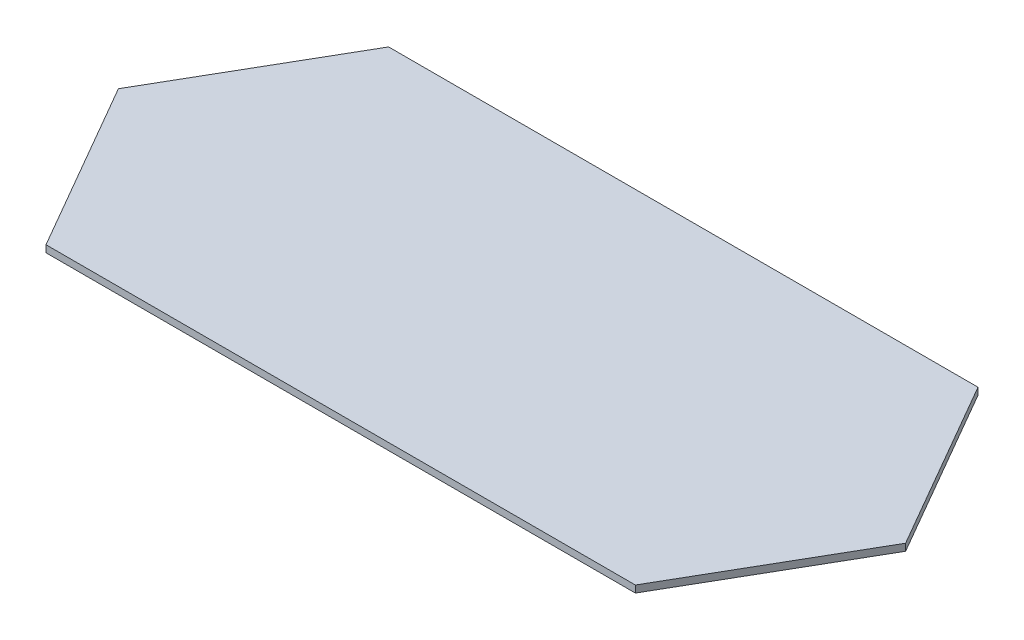
ISO-10303-21;
HEADER;
FILE_DESCRIPTION(('STEP AP214'),'2;1');
FILE_NAME('part.step','',(''),(''),'','','');
FILE_SCHEMA(('AUTOMOTIVE_DESIGN { 1 0 10303 214 1 1 1 1 }'));
ENDSEC;
DATA;
#1=APPLICATION_CONTEXT('core data for automotive mechanical design processes');
#2=APPLICATION_PROTOCOL_DEFINITION('international standard','automotive_design',2000,#1);
#3=PRODUCT_CONTEXT('',#1,'mechanical');
#4=PRODUCT('Part','Part','',(#3));
#5=PRODUCT_RELATED_PRODUCT_CATEGORY('part','',(#4));
#6=PRODUCT_DEFINITION_FORMATION('','',#4);
#7=PRODUCT_DEFINITION_CONTEXT('part definition',#1,'design');
#8=PRODUCT_DEFINITION('design','',#6,#7);
#9=PRODUCT_DEFINITION_SHAPE('','',#8);
#10=(LENGTH_UNIT() NAMED_UNIT(*) SI_UNIT(.MILLI.,.METRE.));
#11=(NAMED_UNIT(*) PLANE_ANGLE_UNIT() SI_UNIT($,.RADIAN.));
#12=(NAMED_UNIT(*) SI_UNIT($,.STERADIAN.) SOLID_ANGLE_UNIT());
#13=UNCERTAINTY_MEASURE_WITH_UNIT(LENGTH_MEASURE(1.E-05),#10,'distance_accuracy_value','');
#14=(GEOMETRIC_REPRESENTATION_CONTEXT(3) GLOBAL_UNCERTAINTY_ASSIGNED_CONTEXT((#13)) GLOBAL_UNIT_ASSIGNED_CONTEXT((#10,
#11,#12)) REPRESENTATION_CONTEXT('',''));
#15=CARTESIAN_POINT('',(0.,0.,0.));
#16=DIRECTION('',(0.,0.,1.));
#17=DIRECTION('',(1.,0.,0.));
#18=AXIS2_PLACEMENT_3D('',#15,#16,#17);
#19=CARTESIAN_POINT('',(445.421268129176,6.35,155.575));
#20=DIRECTION('',(-0.866025403784439,0.,-0.5));
#21=DIRECTION('',(-0.5,0.,0.866025403784439));
#22=AXIS2_PLACEMENT_3D('',#19,#20,#21);
#23=PLANE('',#22);
#24=DIRECTION('',(0.5,0.,-0.866025403784439));
#25=VECTOR('',#24,1.);
#26=CARTESIAN_POINT('',(445.421268129176,0.,155.575));
#27=LINE('',#26,#25);
#28=CARTESIAN_POINT('',(445.421268129176,0.,155.575));
#29=VERTEX_POINT('',#28);
#30=CARTESIAN_POINT('',(535.242536258352,0.,0.));
#31=VERTEX_POINT('',#30);
#32=EDGE_CURVE('E116',#29,#31,#27,.T.);
#33=ORIENTED_EDGE('',*,*,#32,.T.);
#34=DIRECTION('',(0.,-1.,0.));
#35=VECTOR('',#34,1.);
#36=CARTESIAN_POINT('',(535.242536258352,6.35,0.));
#37=LINE('',#36,#35);
#38=CARTESIAN_POINT('',(535.242536258352,6.35,0.));
#39=VERTEX_POINT('',#38);
#40=EDGE_CURVE('E41',#39,#31,#37,.T.);
#41=ORIENTED_EDGE('',*,*,#40,.F.);
#42=DIRECTION('',(0.5,0.,-0.866025403784439));
#43=VECTOR('',#42,1.);
#44=CARTESIAN_POINT('',(445.421268129176,6.35,155.575));
#45=LINE('',#44,#43);
#46=CARTESIAN_POINT('',(445.421268129176,6.35,155.575));
#47=VERTEX_POINT('',#46);
#48=EDGE_CURVE('E140',#47,#39,#45,.T.);
#49=ORIENTED_EDGE('',*,*,#48,.F.);
#50=DIRECTION('',(0.,-1.,0.));
#51=VECTOR('',#50,1.);
#52=CARTESIAN_POINT('',(445.421268129176,6.35,155.575));
#53=LINE('',#52,#51);
#54=EDGE_CURVE('E11',#47,#29,#53,.T.);
#55=ORIENTED_EDGE('',*,*,#54,.T.);
#56=EDGE_LOOP('',(#33,#41,#49,#55));
#57=FACE_BOUND('',#56,.T.);
#58=ADVANCED_FACE('F33',(#57),#23,.F.);
#59=CARTESIAN_POINT('',(535.242536258352,6.35,0.));
#60=DIRECTION('',(-0.866025403784439,0.,0.5));
#61=DIRECTION('',(0.5,0.,0.866025403784439));
#62=AXIS2_PLACEMENT_3D('',#59,#60,#61);
#63=PLANE('',#62);
#64=DIRECTION('',(-0.5,0.,-0.866025403784439));
#65=VECTOR('',#64,1.);
#66=CARTESIAN_POINT('',(535.242536258352,0.,0.));
#67=LINE('',#66,#65);
#68=CARTESIAN_POINT('',(445.421268129176,0.,-155.575));
#69=VERTEX_POINT('',#68);
#70=EDGE_CURVE('E118',#31,#69,#67,.T.);
#71=ORIENTED_EDGE('',*,*,#70,.T.);
#72=DIRECTION('',(0.,-1.,0.));
#73=VECTOR('',#72,1.);
#74=CARTESIAN_POINT('',(445.421268129176,6.35,-155.575));
#75=LINE('',#74,#73);
#76=CARTESIAN_POINT('',(445.421268129176,6.35,-155.575));
#77=VERTEX_POINT('',#76);
#78=EDGE_CURVE('E105',#77,#69,#75,.T.);
#79=ORIENTED_EDGE('',*,*,#78,.F.);
#80=DIRECTION('',(-0.5,0.,-0.866025403784439));
#81=VECTOR('',#80,1.);
#82=CARTESIAN_POINT('',(535.242536258352,6.35,0.));
#83=LINE('',#82,#81);
#84=EDGE_CURVE('E97',#39,#77,#83,.T.);
#85=ORIENTED_EDGE('',*,*,#84,.F.);
#86=ORIENTED_EDGE('',*,*,#40,.T.);
#87=EDGE_LOOP('',(#71,#79,#85,#86));
#88=FACE_BOUND('',#87,.T.);
#89=ADVANCED_FACE('F132',(#88),#63,.F.);
#90=CARTESIAN_POINT('',(89.821268129176,6.35,-155.575));
#91=DIRECTION('',(0.,0.,1.));
#92=DIRECTION('',(1.,0.,0.));
#93=AXIS2_PLACEMENT_3D('',#90,#91,#92);
#94=PLANE('',#93);
#95=DIRECTION('',(-1.,0.,0.));
#96=VECTOR('',#95,1.);
#97=CARTESIAN_POINT('',(89.821268129176,0.,-155.575));
#98=LINE('',#97,#96);
#99=CARTESIAN_POINT('',(-89.821268129176,0.,-155.575));
#100=VERTEX_POINT('',#99);
#101=EDGE_CURVE('E104',#69,#100,#98,.T.);
#102=ORIENTED_EDGE('',*,*,#101,.T.);
#103=DIRECTION('',(0.,-1.,0.));
#104=VECTOR('',#103,1.);
#105=CARTESIAN_POINT('',(-89.821268129176,6.35,-155.575));
#106=LINE('',#105,#104);
#107=CARTESIAN_POINT('',(-89.821268129176,6.35,-155.575));
#108=VERTEX_POINT('',#107);
#109=EDGE_CURVE('E102',#108,#100,#106,.T.);
#110=ORIENTED_EDGE('',*,*,#109,.F.);
#111=DIRECTION('',(-1.,0.,0.));
#112=VECTOR('',#111,1.);
#113=CARTESIAN_POINT('',(445.421268129176,6.35,-155.575));
#114=LINE('',#113,#112);
#115=EDGE_CURVE('E91',#77,#108,#114,.T.);
#116=ORIENTED_EDGE('',*,*,#115,.F.);
#117=ORIENTED_EDGE('',*,*,#78,.T.);
#118=EDGE_LOOP('',(#102,#110,#116,#117));
#119=FACE_BOUND('',#118,.T.);
#120=ADVANCED_FACE('F103',(#119),#94,.F.);
#121=CARTESIAN_POINT('',(-89.821268129176,6.35,-155.575));
#122=DIRECTION('',(0.866025403784439,0.,0.5));
#123=DIRECTION('',(0.5,0.,-0.866025403784439));
#124=AXIS2_PLACEMENT_3D('',#121,#122,#123);
#125=PLANE('',#124);
#126=DIRECTION('',(-0.5,0.,0.866025403784439));
#127=VECTOR('',#126,1.);
#128=CARTESIAN_POINT('',(-89.821268129176,0.,-155.575));
#129=LINE('',#128,#127);
#130=CARTESIAN_POINT('',(-179.642536258352,0.,0.));
#131=VERTEX_POINT('',#130);
#132=EDGE_CURVE('E73',#100,#131,#129,.T.);
#133=ORIENTED_EDGE('',*,*,#132,.T.);
#134=DIRECTION('',(0.,-1.,0.));
#135=VECTOR('',#134,1.);
#136=CARTESIAN_POINT('',(-179.642536258352,6.35,0.));
#137=LINE('',#136,#135);
#138=CARTESIAN_POINT('',(-179.642536258352,6.35,0.));
#139=VERTEX_POINT('',#138);
#140=EDGE_CURVE('E106',#139,#131,#137,.T.);
#141=ORIENTED_EDGE('',*,*,#140,.F.);
#142=DIRECTION('',(-0.5,0.,0.866025403784439));
#143=VECTOR('',#142,1.);
#144=CARTESIAN_POINT('',(-89.821268129176,6.35,-155.575));
#145=LINE('',#144,#143);
#146=EDGE_CURVE('E95',#108,#139,#145,.T.);
#147=ORIENTED_EDGE('',*,*,#146,.F.);
#148=ORIENTED_EDGE('',*,*,#109,.T.);
#149=EDGE_LOOP('',(#133,#141,#147,#148));
#150=FACE_BOUND('',#149,.T.);
#151=ADVANCED_FACE('F108',(#150),#125,.F.);
#152=CARTESIAN_POINT('',(-179.642536258352,6.35,0.));
#153=DIRECTION('',(0.866025403784439,0.,-0.5));
#154=DIRECTION('',(-0.5,0.,-0.866025403784439));
#155=AXIS2_PLACEMENT_3D('',#152,#153,#154);
#156=PLANE('',#155);
#157=DIRECTION('',(0.5,0.,0.866025403784439));
#158=VECTOR('',#157,1.);
#159=CARTESIAN_POINT('',(-179.642536258352,0.,0.));
#160=LINE('',#159,#158);
#161=CARTESIAN_POINT('',(-89.821268129176,0.,155.575));
#162=VERTEX_POINT('',#161);
#163=EDGE_CURVE('E80',#131,#162,#160,.T.);
#164=ORIENTED_EDGE('',*,*,#163,.T.);
#165=DIRECTION('',(0.,-1.,0.));
#166=VECTOR('',#165,1.);
#167=CARTESIAN_POINT('',(-89.821268129176,6.35,155.575));
#168=LINE('',#167,#166);
#169=CARTESIAN_POINT('',(-89.821268129176,6.35,155.575));
#170=VERTEX_POINT('',#169);
#171=EDGE_CURVE('E112',#170,#162,#168,.T.);
#172=ORIENTED_EDGE('',*,*,#171,.F.);
#173=DIRECTION('',(0.5,0.,0.866025403784439));
#174=VECTOR('',#173,1.);
#175=CARTESIAN_POINT('',(-179.642536258352,6.35,0.));
#176=LINE('',#175,#174);
#177=EDGE_CURVE('E110',#139,#170,#176,.T.);
#178=ORIENTED_EDGE('',*,*,#177,.F.);
#179=ORIENTED_EDGE('',*,*,#140,.T.);
#180=EDGE_LOOP('',(#164,#172,#178,#179));
#181=FACE_BOUND('',#180,.T.);
#182=ADVANCED_FACE('F154',(#181),#156,.F.);
#183=CARTESIAN_POINT('',(-89.821268129176,6.35,155.575));
#184=DIRECTION('',(0.,0.,-1.));
#185=DIRECTION('',(-1.,0.,0.));
#186=AXIS2_PLACEMENT_3D('',#183,#184,#185);
#187=PLANE('',#186);
#188=DIRECTION('',(1.,0.,0.));
#189=VECTOR('',#188,1.);
#190=CARTESIAN_POINT('',(-89.821268129176,0.,155.575));
#191=LINE('',#190,#189);
#192=EDGE_CURVE('E124',#162,#29,#191,.T.);
#193=ORIENTED_EDGE('',*,*,#192,.T.);
#194=ORIENTED_EDGE('',*,*,#54,.F.);
#195=DIRECTION('',(1.,0.,0.));
#196=VECTOR('',#195,1.);
#197=CARTESIAN_POINT('',(265.778731870824,6.35,155.575));
#198=LINE('',#197,#196);
#199=EDGE_CURVE('E49',#170,#47,#198,.T.);
#200=ORIENTED_EDGE('',*,*,#199,.F.);
#201=ORIENTED_EDGE('',*,*,#171,.T.);
#202=EDGE_LOOP('',(#193,#194,#200,#201));
#203=FACE_BOUND('',#202,.T.);
#204=ADVANCED_FACE('F139',(#203),#187,.F.);
#205=CARTESIAN_POINT('',(0.,6.35,0.));
#206=DIRECTION('',(0.,1.,0.));
#207=DIRECTION('',(0.,0.,1.));
#208=AXIS2_PLACEMENT_3D('',#205,#206,#207);
#209=PLANE('',#208);
#210=ORIENTED_EDGE('',*,*,#199,.T.);
#211=ORIENTED_EDGE('',*,*,#48,.T.);
#212=ORIENTED_EDGE('',*,*,#84,.T.);
#213=ORIENTED_EDGE('',*,*,#115,.T.);
#214=ORIENTED_EDGE('',*,*,#146,.T.);
#215=ORIENTED_EDGE('',*,*,#177,.T.);
#216=EDGE_LOOP('',(#210,#211,#212,#213,#214,#215));
#217=FACE_BOUND('',#216,.T.);
#218=ADVANCED_FACE('F93',(#217),#209,.T.);
#219=CARTESIAN_POINT('',(0.,0.,0.));
#220=DIRECTION('',(0.,1.,0.));
#221=DIRECTION('',(0.,0.,1.));
#222=AXIS2_PLACEMENT_3D('',#219,#220,#221);
#223=PLANE('',#222);
#224=ORIENTED_EDGE('',*,*,#32,.F.);
#225=ORIENTED_EDGE('',*,*,#192,.F.);
#226=ORIENTED_EDGE('',*,*,#163,.F.);
#227=ORIENTED_EDGE('',*,*,#132,.F.);
#228=ORIENTED_EDGE('',*,*,#101,.F.);
#229=ORIENTED_EDGE('',*,*,#70,.F.);
#230=EDGE_LOOP('',(#224,#225,#226,#227,#228,#229));
#231=FACE_BOUND('',#230,.T.);
#232=ADVANCED_FACE('F137',(#231),#223,.F.);
#233=CLOSED_SHELL('',(#58,#89,#120,#151,#182,#204,#218,#232));
#234=MANIFOLD_SOLID_BREP('B2',#233);
#235=ADVANCED_BREP_SHAPE_REPRESENTATION('',(#18,#234),#14);
#236=SHAPE_DEFINITION_REPRESENTATION(#9,#235);
ENDSEC;
END-ISO-10303-21;
